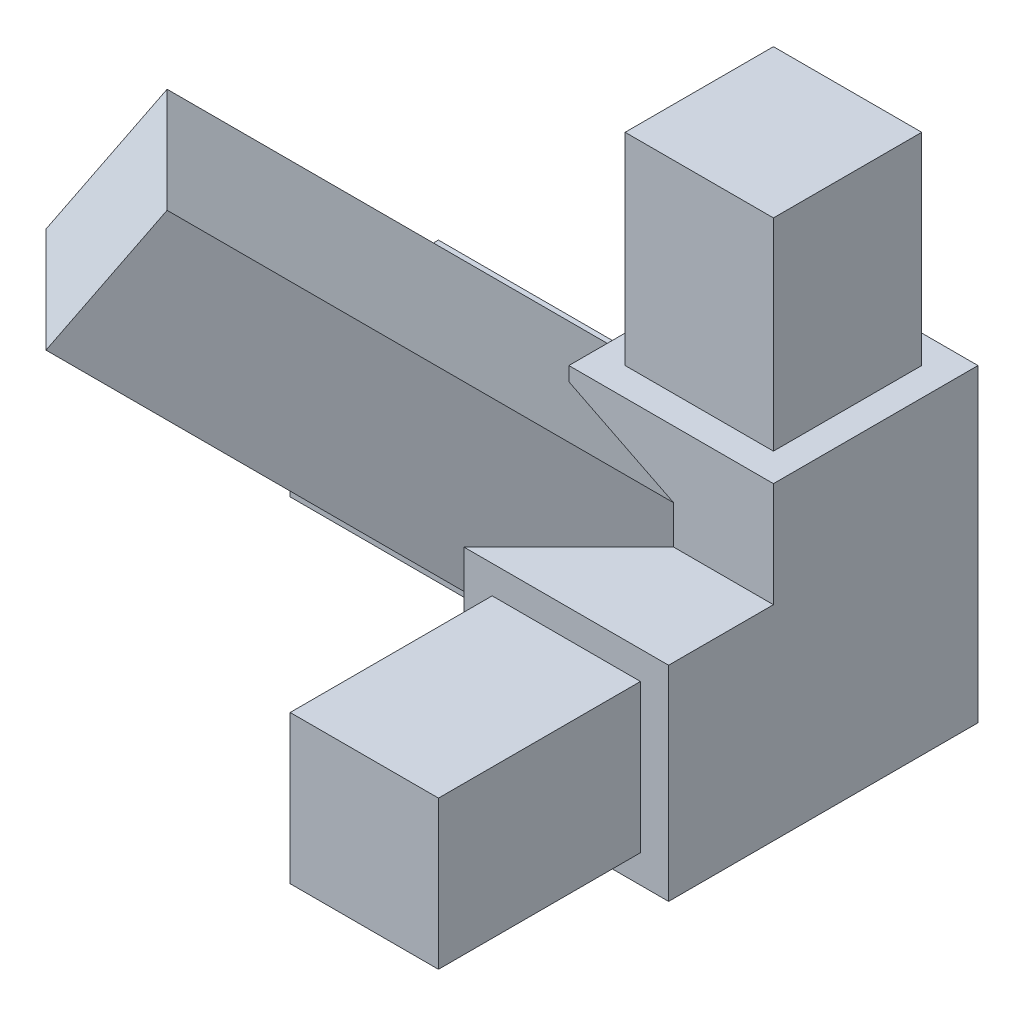
ISO-10303-21;
HEADER;
FILE_DESCRIPTION(('STEP AP214'),'2;1');
FILE_NAME('part.step','',(''),(''),'','','');
FILE_SCHEMA(('AUTOMOTIVE_DESIGN { 1 0 10303 214 1 1 1 1 }'));
ENDSEC;
DATA;
#1=APPLICATION_CONTEXT('core data for automotive mechanical design processes');
#2=APPLICATION_PROTOCOL_DEFINITION('international standard','automotive_design',2000,#1);
#3=PRODUCT_CONTEXT('',#1,'mechanical');
#4=PRODUCT('Part','Part','',(#3));
#5=PRODUCT_RELATED_PRODUCT_CATEGORY('part','',(#4));
#6=PRODUCT_DEFINITION_FORMATION('','',#4);
#7=PRODUCT_DEFINITION_CONTEXT('part definition',#1,'design');
#8=PRODUCT_DEFINITION('design','',#6,#7);
#9=PRODUCT_DEFINITION_SHAPE('','',#8);
#10=(LENGTH_UNIT() NAMED_UNIT(*) SI_UNIT(.MILLI.,.METRE.));
#11=(NAMED_UNIT(*) PLANE_ANGLE_UNIT() SI_UNIT($,.RADIAN.));
#12=(NAMED_UNIT(*) SI_UNIT($,.STERADIAN.) SOLID_ANGLE_UNIT());
#13=UNCERTAINTY_MEASURE_WITH_UNIT(LENGTH_MEASURE(1.E-05),#10,'distance_accuracy_value','');
#14=(GEOMETRIC_REPRESENTATION_CONTEXT(3) GLOBAL_UNCERTAINTY_ASSIGNED_CONTEXT((#13)) GLOBAL_UNIT_ASSIGNED_CONTEXT((#10,
#11,#12)) REPRESENTATION_CONTEXT('',''));
#15=CARTESIAN_POINT('',(0.,0.,0.));
#16=DIRECTION('',(0.,0.,1.));
#17=DIRECTION('',(1.,0.,0.));
#18=AXIS2_PLACEMENT_3D('',#15,#16,#17);
#19=CARTESIAN_POINT('',(-9.80563965077673,15.4080094432533,13.9068589816587));
#20=DIRECTION('',(0.707106781186547,0.,0.707106781186548));
#21=DIRECTION('',(0.707106781186548,0.,-0.707106781186547));
#22=AXIS2_PLACEMENT_3D('',#19,#20,#21);
#23=PLANE('',#22);
#24=DIRECTION('',(-0.707106781186548,0.,0.707106781186547));
#25=VECTOR('',#24,1.);
#26=CARTESIAN_POINT('',(7.23568440832457,4.,-3.13446507744259));
#27=LINE('',#26,#25);
#28=CARTESIAN_POINT('',(0.101219330881973,4.,4.));
#29=VERTEX_POINT('',#28);
#30=CARTESIAN_POINT('',(-3.99878066911803,4.,8.1));
#31=VERTEX_POINT('',#30);
#32=EDGE_CURVE('E334',#29,#31,#27,.T.);
#33=ORIENTED_EDGE('',*,*,#32,.F.);
#34=DIRECTION('',(0.,1.,0.));
#35=VECTOR('',#34,1.);
#36=CARTESIAN_POINT('',(0.101219330881976,15.4080094432533,4.));
#37=LINE('',#36,#35);
#38=CARTESIAN_POINT('',(0.101219330881973,5.50115046159462,4.));
#39=VERTEX_POINT('',#38);
#40=EDGE_CURVE('E261',#29,#39,#37,.T.);
#41=ORIENTED_EDGE('',*,*,#40,.T.);
#42=DIRECTION('',(0.577350269189626,-0.577350269189626,-0.577350269189626));
#43=VECTOR('',#42,1.);
#44=CARTESIAN_POINT('',(-9.80563965077673,15.4080094432533,13.9068589816587));
#45=LINE('',#44,#43);
#46=CARTESIAN_POINT('',(-9.80563965077673,15.4080094432533,13.9068589816587));
#47=VERTEX_POINT('',#46);
#48=EDGE_CURVE('E353',#47,#39,#45,.T.);
#49=ORIENTED_EDGE('',*,*,#48,.F.);
#50=DIRECTION('',(-0.408248290463863,-0.816496580927726,0.408248290463863));
#51=VECTOR('',#50,1.);
#52=CARTESIAN_POINT('',(-9.80563965077673,15.4080094432533,13.9068589816587));
#53=LINE('',#52,#51);
#54=CARTESIAN_POINT('',(-12.1734797354671,10.6723292738725,16.2746990663491));
#55=VERTEX_POINT('',#54);
#56=EDGE_CURVE('E336',#47,#55,#53,.T.);
#57=ORIENTED_EDGE('',*,*,#56,.T.);
#58=DIRECTION('',(0.577350269189626,-0.577350269189626,-0.577350269189626));
#59=VECTOR('',#58,1.);
#60=CARTESIAN_POINT('',(-12.1734797354671,10.6723292738725,16.2746990663491));
#61=LINE('',#60,#59);
#62=CARTESIAN_POINT('',(-3.99878066911803,2.49763020752341,8.1));
#63=VERTEX_POINT('',#62);
#64=EDGE_CURVE('E352',#55,#63,#61,.T.);
#65=ORIENTED_EDGE('',*,*,#64,.T.);
#66=DIRECTION('',(0.,1.,0.));
#67=VECTOR('',#66,1.);
#68=CARTESIAN_POINT('',(-3.99878066911802,15.4080094432533,8.1));
#69=LINE('',#68,#67);
#70=EDGE_CURVE('E433',#63,#31,#69,.T.);
#71=ORIENTED_EDGE('',*,*,#70,.T.);
#72=EDGE_LOOP('',(#33,#41,#49,#57,#65,#71));
#73=FACE_BOUND('',#72,.T.);
#74=ADVANCED_FACE('F39',(#73),#23,.T.);
#75=CARTESIAN_POINT('',(-13.9068589816587,15.4080094432533,9.80563965077673));
#76=DIRECTION('',(-0.707106781186548,0.,-0.707106781186548));
#77=DIRECTION('',(-0.707106781186548,0.,0.707106781186548));
#78=AXIS2_PLACEMENT_3D('',#75,#76,#77);
#79=PLANE('',#78);
#80=DIRECTION('',(0.577350269189626,-0.577350269189626,-0.577350269189626));
#81=VECTOR('',#80,1.);
#82=CARTESIAN_POINT('',(-13.9068589816587,15.4080094432533,9.80563965077673));
#83=LINE('',#82,#81);
#84=CARTESIAN_POINT('',(-13.9068589816587,15.4080094432533,9.80563965077673));
#85=VERTEX_POINT('',#84);
#86=CARTESIAN_POINT('',(-4.,5.50115046159462,-0.10121933088198));
#87=VERTEX_POINT('',#86);
#88=EDGE_CURVE('E357',#85,#87,#83,.T.);
#89=ORIENTED_EDGE('',*,*,#88,.T.);
#90=DIRECTION('',(0.,-1.,0.));
#91=VECTOR('',#90,1.);
#92=CARTESIAN_POINT('',(-4.,15.4080094432533,-0.101219330881976));
#93=LINE('',#92,#91);
#94=CARTESIAN_POINT('',(-4.,4.,-0.101219330881975));
#95=VERTEX_POINT('',#94);
#96=EDGE_CURVE('E264',#87,#95,#93,.T.);
#97=ORIENTED_EDGE('',*,*,#96,.T.);
#98=DIRECTION('',(0.707106781186548,0.,-0.707106781186548));
#99=VECTOR('',#98,1.);
#100=CARTESIAN_POINT('',(3.13446507744259,4.,-7.23568440832457));
#101=LINE('',#100,#99);
#102=CARTESIAN_POINT('',(-8.1,4.,3.99878066911802));
#103=VERTEX_POINT('',#102);
#104=EDGE_CURVE('E333',#103,#95,#101,.T.);
#105=ORIENTED_EDGE('',*,*,#104,.F.);
#106=DIRECTION('',(0.,1.,0.));
#107=VECTOR('',#106,1.);
#108=CARTESIAN_POINT('',(-8.1,15.4080094432533,3.99878066911802));
#109=LINE('',#108,#107);
#110=CARTESIAN_POINT('',(-8.1,2.4976302075234,3.99878066911802));
#111=VERTEX_POINT('',#110);
#112=EDGE_CURVE('E318',#111,#103,#109,.T.);
#113=ORIENTED_EDGE('',*,*,#112,.F.);
#114=DIRECTION('',(0.577350269189626,-0.577350269189626,-0.577350269189626));
#115=VECTOR('',#114,1.);
#116=CARTESIAN_POINT('',(-16.2746990663491,10.6723292738725,12.1734797354671));
#117=LINE('',#116,#115);
#118=CARTESIAN_POINT('',(-16.2746990663491,10.6723292738725,12.1734797354671));
#119=VERTEX_POINT('',#118);
#120=EDGE_CURVE('E360',#119,#111,#117,.T.);
#121=ORIENTED_EDGE('',*,*,#120,.F.);
#122=DIRECTION('',(0.408248290463863,0.816496580927726,-0.408248290463863));
#123=VECTOR('',#122,1.);
#124=CARTESIAN_POINT('',(-13.9068589816587,15.4080094432533,9.80563965077673));
#125=LINE('',#124,#123);
#126=EDGE_CURVE('E346',#119,#85,#125,.T.);
#127=ORIENTED_EDGE('',*,*,#126,.T.);
#128=EDGE_LOOP('',(#89,#97,#105,#113,#121,#127));
#129=FACE_BOUND('',#128,.T.);
#130=ADVANCED_FACE('F445',(#129),#79,.T.);
#131=CARTESIAN_POINT('',(0.,4.,0.));
#132=DIRECTION('',(0.,-1.,0.));
#133=DIRECTION('',(0.,0.,-1.));
#134=AXIS2_PLACEMENT_3D('',#131,#132,#133);
#135=PLANE('',#134);
#136=DIRECTION('',(0.,0.,1.));
#137=VECTOR('',#136,1.);
#138=CARTESIAN_POINT('',(-4.,4.,4.));
#139=LINE('',#138,#137);
#140=CARTESIAN_POINT('',(-4.,4.,-4.));
#141=VERTEX_POINT('',#140);
#142=EDGE_CURVE('E250',#141,#95,#139,.T.);
#143=ORIENTED_EDGE('',*,*,#142,.F.);
#144=DIRECTION('',(-1.,0.,0.));
#145=VECTOR('',#144,1.);
#146=CARTESIAN_POINT('',(-4.,4.,-4.));
#147=LINE('',#146,#145);
#148=CARTESIAN_POINT('',(-8.1,4.,-4.));
#149=VERTEX_POINT('',#148);
#150=EDGE_CURVE('E232',#141,#149,#147,.T.);
#151=ORIENTED_EDGE('',*,*,#150,.T.);
#152=DIRECTION('',(0.,0.,-1.));
#153=VECTOR('',#152,1.);
#154=CARTESIAN_POINT('',(-8.1,4.,4.));
#155=LINE('',#154,#153);
#156=EDGE_CURVE('E315',#103,#149,#155,.T.);
#157=ORIENTED_EDGE('',*,*,#156,.F.);
#158=ORIENTED_EDGE('',*,*,#104,.T.);
#159=EDGE_LOOP('',(#143,#151,#157,#158));
#160=FACE_BOUND('',#159,.T.);
#161=ADVANCED_FACE('F464',(#160),#135,.F.);
#162=DIRECTION('',(1.,0.,0.));
#163=VECTOR('',#162,1.);
#164=CARTESIAN_POINT('',(-4.,4.,4.));
#165=LINE('',#164,#163);
#166=CARTESIAN_POINT('',(4.,4.,4.));
#167=VERTEX_POINT('',#166);
#168=EDGE_CURVE('E248',#29,#167,#165,.T.);
#169=ORIENTED_EDGE('',*,*,#168,.F.);
#170=ORIENTED_EDGE('',*,*,#32,.T.);
#171=DIRECTION('',(-1.,0.,0.));
#172=VECTOR('',#171,1.);
#173=CARTESIAN_POINT('',(-4.,4.,8.1));
#174=LINE('',#173,#172);
#175=CARTESIAN_POINT('',(4.,4.,8.1));
#176=VERTEX_POINT('',#175);
#177=EDGE_CURVE('E276',#176,#31,#174,.T.);
#178=ORIENTED_EDGE('',*,*,#177,.F.);
#179=DIRECTION('',(0.,0.,-1.));
#180=VECTOR('',#179,1.);
#181=CARTESIAN_POINT('',(4.,4.,4.));
#182=LINE('',#181,#180);
#183=EDGE_CURVE('E422',#176,#167,#182,.T.);
#184=ORIENTED_EDGE('',*,*,#183,.T.);
#185=EDGE_LOOP('',(#169,#170,#178,#184));
#186=FACE_BOUND('',#185,.T.);
#187=ADVANCED_FACE('F459',(#186),#135,.F.);
#188=CARTESIAN_POINT('',(-13.9068589816587,15.4080094432533,9.80563965077673));
#189=DIRECTION('',(0.408248290463863,0.816496580927726,-0.408248290463863));
#190=DIRECTION('',(-0.894427190999916,0.447213595499958,0.));
#191=AXIS2_PLACEMENT_3D('',#188,#189,#190);
#192=PLANE('',#191);
#193=DIRECTION('',(-0.894427190999916,0.447213595499958,0.));
#194=VECTOR('',#193,1.);
#195=CARTESIAN_POINT('',(-15.0679869118141,13.0857535829426,4.));
#196=LINE('',#195,#194);
#197=CARTESIAN_POINT('',(-4.,7.55176012703561,4.));
#198=VERTEX_POINT('',#197);
#199=EDGE_CURVE('E436',#39,#198,#196,.T.);
#200=ORIENTED_EDGE('',*,*,#199,.T.);
#201=DIRECTION('',(0.,-0.447213595499958,-0.894427190999916));
#202=VECTOR('',#201,1.);
#203=CARTESIAN_POINT('',(-4.,11.4452658505898,11.7870114471085));
#204=LINE('',#203,#202);
#205=EDGE_CURVE('E47',#198,#87,#204,.T.);
#206=ORIENTED_EDGE('',*,*,#205,.T.);
#207=ORIENTED_EDGE('',*,*,#88,.F.);
#208=DIRECTION('',(0.707106781186547,0.,0.707106781186548));
#209=VECTOR('',#208,1.);
#210=CARTESIAN_POINT('',(-13.9068589816587,15.4080094432533,9.80563965077673));
#211=LINE('',#210,#209);
#212=EDGE_CURVE('E349',#85,#47,#211,.T.);
#213=ORIENTED_EDGE('',*,*,#212,.T.);
#214=ORIENTED_EDGE('',*,*,#48,.T.);
#215=EDGE_LOOP('',(#200,#206,#207,#213,#214));
#216=FACE_BOUND('',#215,.T.);
#217=ADVANCED_FACE('F441',(#216),#192,.T.);
#218=CARTESIAN_POINT('',(-16.2746990663491,10.6723292738725,12.1734797354671));
#219=DIRECTION('',(-0.408248290463863,-0.816496580927726,0.408248290463863));
#220=DIRECTION('',(0.,-0.447213595499958,-0.894427190999916));
#221=AXIS2_PLACEMENT_3D('',#218,#219,#220);
#222=PLANE('',#221);
#223=DIRECTION('',(-0.894427190999916,0.447213595499958,0.));
#224=VECTOR('',#223,1.);
#225=CARTESIAN_POINT('',(2.54019385747902,-2.82185705577512,4.));
#226=LINE('',#225,#224);
#227=CARTESIAN_POINT('',(-4.,0.448239872964393,4.));
#228=VERTEX_POINT('',#227);
#229=CARTESIAN_POINT('',(-8.1,2.49823987296439,4.));
#230=VERTEX_POINT('',#229);
#231=EDGE_CURVE('E337',#228,#230,#226,.T.);
#232=ORIENTED_EDGE('',*,*,#231,.F.);
#233=DIRECTION('',(0.,0.447213595499958,0.894427190999916));
#234=VECTOR('',#233,1.);
#235=CARTESIAN_POINT('',(-4.,5.76244964733288,14.628419548737));
#236=LINE('',#235,#234);
#237=CARTESIAN_POINT('',(-4.,2.49823987296439,8.1));
#238=VERTEX_POINT('',#237);
#239=EDGE_CURVE('E303',#228,#238,#236,.T.);
#240=ORIENTED_EDGE('',*,*,#239,.T.);
#241=DIRECTION('',(0.894427190999916,-0.447213595499958,0.));
#242=VECTOR('',#241,1.);
#243=CARTESIAN_POINT('',(-17.0893950134425,9.04293737968566,8.1));
#244=LINE('',#243,#242);
#245=EDGE_CURVE('E288',#238,#63,#244,.T.);
#246=ORIENTED_EDGE('',*,*,#245,.T.);
#247=ORIENTED_EDGE('',*,*,#64,.F.);
#248=DIRECTION('',(-0.707106781186548,0.,-0.707106781186548));
#249=VECTOR('',#248,1.);
#250=CARTESIAN_POINT('',(-16.2746990663491,10.6723292738725,12.1734797354671));
#251=LINE('',#250,#249);
#252=EDGE_CURVE('E343',#55,#119,#251,.T.);
#253=ORIENTED_EDGE('',*,*,#252,.T.);
#254=ORIENTED_EDGE('',*,*,#120,.T.);
#255=DIRECTION('',(0.,-0.447213595499958,-0.894427190999916));
#256=VECTOR('',#255,1.);
#257=CARTESIAN_POINT('',(-8.1,7.40244964733288,13.808419548737));
#258=LINE('',#257,#256);
#259=EDGE_CURVE('E231',#230,#111,#258,.T.);
#260=ORIENTED_EDGE('',*,*,#259,.F.);
#261=EDGE_LOOP('',(#232,#240,#246,#247,#253,#254,#260));
#262=FACE_BOUND('',#261,.T.);
#263=ADVANCED_FACE('F475',(#262),#222,.T.);
#264=CARTESIAN_POINT('',(-4.,4.,4.));
#265=DIRECTION('',(0.,0.,-1.));
#266=DIRECTION('',(-1.,0.,0.));
#267=AXIS2_PLACEMENT_3D('',#264,#265,#266);
#268=PLANE('',#267);
#269=DIRECTION('',(0.,-1.,0.));
#270=VECTOR('',#269,1.);
#271=CARTESIAN_POINT('',(-4.,-4.,4.));
#272=LINE('',#271,#270);
#273=CARTESIAN_POINT('',(-4.,-4.,4.));
#274=VERTEX_POINT('',#273);
#275=EDGE_CURVE('E272',#228,#274,#272,.T.);
#276=ORIENTED_EDGE('',*,*,#275,.F.);
#277=ORIENTED_EDGE('',*,*,#231,.T.);
#278=DIRECTION('',(0.,1.,0.));
#279=VECTOR('',#278,1.);
#280=CARTESIAN_POINT('',(-8.1,-4.,4.));
#281=LINE('',#280,#279);
#282=CARTESIAN_POINT('',(-8.1,-4.,4.));
#283=VERTEX_POINT('',#282);
#284=EDGE_CURVE('E312',#283,#230,#281,.T.);
#285=ORIENTED_EDGE('',*,*,#284,.F.);
#286=DIRECTION('',(1.,0.,0.));
#287=VECTOR('',#286,1.);
#288=CARTESIAN_POINT('',(-4.,-4.,4.));
#289=LINE('',#288,#287);
#290=EDGE_CURVE('E421',#283,#274,#289,.T.);
#291=ORIENTED_EDGE('',*,*,#290,.T.);
#292=EDGE_LOOP('',(#276,#277,#285,#291));
#293=FACE_BOUND('',#292,.T.);
#294=ADVANCED_FACE('F41',(#293),#268,.F.);
#295=CARTESIAN_POINT('',(4.,4.,4.));
#296=DIRECTION('',(-1.,0.,0.));
#297=DIRECTION('',(0.,0.,1.));
#298=AXIS2_PLACEMENT_3D('',#295,#296,#297);
#299=PLANE('',#298);
#300=DIRECTION('',(0.,0.,-1.));
#301=VECTOR('',#300,1.);
#302=CARTESIAN_POINT('',(4.,-4.,4.));
#303=LINE('',#302,#301);
#304=CARTESIAN_POINT('',(4.,-4.,8.1));
#305=VERTEX_POINT('',#304);
#306=CARTESIAN_POINT('',(4.,-4.,-4.));
#307=VERTEX_POINT('',#306);
#308=EDGE_CURVE('E228',#305,#307,#303,.T.);
#309=ORIENTED_EDGE('',*,*,#308,.T.);
#310=DIRECTION('',(0.,-1.,0.));
#311=VECTOR('',#310,1.);
#312=CARTESIAN_POINT('',(4.,4.,-4.));
#313=LINE('',#312,#311);
#314=CARTESIAN_POINT('',(4.,8.1,-4.));
#315=VERTEX_POINT('',#314);
#316=EDGE_CURVE('E221',#315,#307,#313,.T.);
#317=ORIENTED_EDGE('',*,*,#316,.F.);
#318=DIRECTION('',(0.,0.,-1.));
#319=VECTOR('',#318,1.);
#320=CARTESIAN_POINT('',(4.,8.1,4.));
#321=LINE('',#320,#319);
#322=CARTESIAN_POINT('',(4.,8.1,4.));
#323=VERTEX_POINT('',#322);
#324=EDGE_CURVE('E226',#323,#315,#321,.T.);
#325=ORIENTED_EDGE('',*,*,#324,.F.);
#326=DIRECTION('',(0.,-1.,0.));
#327=VECTOR('',#326,1.);
#328=CARTESIAN_POINT('',(4.,8.1,4.));
#329=LINE('',#328,#327);
#330=EDGE_CURVE('E255',#323,#167,#329,.T.);
#331=ORIENTED_EDGE('',*,*,#330,.T.);
#332=ORIENTED_EDGE('',*,*,#183,.F.);
#333=DIRECTION('',(0.,1.,0.));
#334=VECTOR('',#333,1.);
#335=CARTESIAN_POINT('',(4.,-4.,8.1));
#336=LINE('',#335,#334);
#337=EDGE_CURVE('E273',#305,#176,#336,.T.);
#338=ORIENTED_EDGE('',*,*,#337,.F.);
#339=EDGE_LOOP('',(#309,#317,#325,#331,#332,#338));
#340=FACE_BOUND('',#339,.T.);
#341=ADVANCED_FACE('F223',(#340),#299,.F.);
#342=CARTESIAN_POINT('',(-4.,4.,-4.));
#343=DIRECTION('',(0.,0.,1.));
#344=DIRECTION('',(1.,0.,0.));
#345=AXIS2_PLACEMENT_3D('',#342,#343,#344);
#346=PLANE('',#345);
#347=DIRECTION('',(-1.,0.,0.));
#348=VECTOR('',#347,1.);
#349=CARTESIAN_POINT('',(-4.,-4.,-4.));
#350=LINE('',#349,#348);
#351=CARTESIAN_POINT('',(-8.1,-4.,-4.));
#352=VERTEX_POINT('',#351);
#353=EDGE_CURVE('E425',#307,#352,#350,.T.);
#354=ORIENTED_EDGE('',*,*,#353,.T.);
#355=DIRECTION('',(0.,-1.,0.));
#356=VECTOR('',#355,1.);
#357=CARTESIAN_POINT('',(-8.1,-4.,-4.));
#358=LINE('',#357,#356);
#359=EDGE_CURVE('E306',#149,#352,#358,.T.);
#360=ORIENTED_EDGE('',*,*,#359,.F.);
#361=ORIENTED_EDGE('',*,*,#150,.F.);
#362=DIRECTION('',(0.,-1.,0.));
#363=VECTOR('',#362,1.);
#364=CARTESIAN_POINT('',(-4.,8.1,-4.));
#365=LINE('',#364,#363);
#366=CARTESIAN_POINT('',(-4.,8.1,-4.));
#367=VERTEX_POINT('',#366);
#368=EDGE_CURVE('E238',#367,#141,#365,.T.);
#369=ORIENTED_EDGE('',*,*,#368,.F.);
#370=DIRECTION('',(-1.,0.,0.));
#371=VECTOR('',#370,1.);
#372=CARTESIAN_POINT('',(-4.,8.1,-4.));
#373=LINE('',#372,#371);
#374=EDGE_CURVE('E235',#315,#367,#373,.T.);
#375=ORIENTED_EDGE('',*,*,#374,.F.);
#376=ORIENTED_EDGE('',*,*,#316,.T.);
#377=EDGE_LOOP('',(#354,#360,#361,#369,#375,#376));
#378=FACE_BOUND('',#377,.T.);
#379=ADVANCED_FACE('F236',(#378),#346,.F.);
#380=CARTESIAN_POINT('',(0.,-4.,0.));
#381=DIRECTION('',(0.,-1.,0.));
#382=DIRECTION('',(0.,0.,-1.));
#383=AXIS2_PLACEMENT_3D('',#380,#381,#382);
#384=PLANE('',#383);
#385=ORIENTED_EDGE('',*,*,#290,.F.);
#386=DIRECTION('',(0.,0.,1.));
#387=VECTOR('',#386,1.);
#388=CARTESIAN_POINT('',(-8.1,-4.,4.));
#389=LINE('',#388,#387);
#390=EDGE_CURVE('E309',#352,#283,#389,.T.);
#391=ORIENTED_EDGE('',*,*,#390,.F.);
#392=ORIENTED_EDGE('',*,*,#353,.F.);
#393=ORIENTED_EDGE('',*,*,#308,.F.);
#394=DIRECTION('',(1.,0.,0.));
#395=VECTOR('',#394,1.);
#396=CARTESIAN_POINT('',(-4.,-4.,8.1));
#397=LINE('',#396,#395);
#398=CARTESIAN_POINT('',(-4.,-4.,8.1));
#399=VERTEX_POINT('',#398);
#400=EDGE_CURVE('E281',#399,#305,#397,.T.);
#401=ORIENTED_EDGE('',*,*,#400,.F.);
#402=DIRECTION('',(0.,0.,-1.));
#403=VECTOR('',#402,1.);
#404=CARTESIAN_POINT('',(-4.,-4.,8.1));
#405=LINE('',#404,#403);
#406=EDGE_CURVE('E284',#399,#274,#405,.T.);
#407=ORIENTED_EDGE('',*,*,#406,.T.);
#408=EDGE_LOOP('',(#385,#391,#392,#393,#401,#407));
#409=FACE_BOUND('',#408,.T.);
#410=ADVANCED_FACE('F483',(#409),#384,.T.);
#411=CARTESIAN_POINT('',(-13.0401693585629,13.0401693585629,13.0401693585629));
#412=DIRECTION('',(-0.577350269189626,0.577350269189626,0.577350269189626));
#413=DIRECTION('',(0.,-0.707106781186548,0.707106781186548));
#414=AXIS2_PLACEMENT_3D('',#411,#412,#413);
#415=PLANE('',#414);
#416=ORIENTED_EDGE('',*,*,#56,.F.);
#417=ORIENTED_EDGE('',*,*,#212,.F.);
#418=ORIENTED_EDGE('',*,*,#126,.F.);
#419=ORIENTED_EDGE('',*,*,#252,.F.);
#420=EDGE_LOOP('',(#416,#417,#418,#419));
#421=FACE_BOUND('',#420,.T.);
#422=ADVANCED_FACE('F452',(#421),#415,.T.);
#423=CARTESIAN_POINT('',(-8.1,0.,0.));
#424=DIRECTION('',(-1.,0.,0.));
#425=DIRECTION('',(0.,0.,1.));
#426=AXIS2_PLACEMENT_3D('',#423,#424,#425);
#427=PLANE('',#426);
#428=ORIENTED_EDGE('',*,*,#259,.T.);
#429=ORIENTED_EDGE('',*,*,#112,.T.);
#430=ORIENTED_EDGE('',*,*,#156,.T.);
#431=ORIENTED_EDGE('',*,*,#359,.T.);
#432=ORIENTED_EDGE('',*,*,#390,.T.);
#433=ORIENTED_EDGE('',*,*,#284,.T.);
#434=EDGE_LOOP('',(#428,#429,#430,#431,#432,#433));
#435=FACE_BOUND('',#434,.T.);
#436=DIRECTION('',(0.,-1.,0.));
#437=VECTOR('',#436,1.);
#438=CARTESIAN_POINT('',(-8.1,-2.9,-2.9));
#439=LINE('',#438,#437);
#440=CARTESIAN_POINT('',(-8.1,2.9,-2.9));
#441=VERTEX_POINT('',#440);
#442=CARTESIAN_POINT('',(-8.1,-2.9,-2.9));
#443=VERTEX_POINT('',#442);
#444=EDGE_CURVE('E330',#441,#443,#439,.T.);
#445=ORIENTED_EDGE('',*,*,#444,.F.);
#446=DIRECTION('',(0.,0.,-1.));
#447=VECTOR('',#446,1.);
#448=CARTESIAN_POINT('',(-8.1,2.9,2.9));
#449=LINE('',#448,#447);
#450=CARTESIAN_POINT('',(-8.1,2.9,2.9));
#451=VERTEX_POINT('',#450);
#452=EDGE_CURVE('E321',#451,#441,#449,.T.);
#453=ORIENTED_EDGE('',*,*,#452,.F.);
#454=DIRECTION('',(0.,1.,0.));
#455=VECTOR('',#454,1.);
#456=CARTESIAN_POINT('',(-8.1,-2.9,2.9));
#457=LINE('',#456,#455);
#458=CARTESIAN_POINT('',(-8.1,-2.9,2.9));
#459=VERTEX_POINT('',#458);
#460=EDGE_CURVE('E324',#459,#451,#457,.T.);
#461=ORIENTED_EDGE('',*,*,#460,.F.);
#462=DIRECTION('',(0.,0.,1.));
#463=VECTOR('',#462,1.);
#464=CARTESIAN_POINT('',(-8.1,-2.9,2.9));
#465=LINE('',#464,#463);
#466=EDGE_CURVE('E327',#443,#459,#465,.T.);
#467=ORIENTED_EDGE('',*,*,#466,.F.);
#468=EDGE_LOOP('',(#445,#453,#461,#467));
#469=FACE_BOUND('',#468,.T.);
#470=ADVANCED_FACE('F469',(#435,#469),#427,.T.);
#471=CARTESIAN_POINT('',(-16.,0.,0.));
#472=DIRECTION('',(-1.,0.,0.));
#473=DIRECTION('',(0.,0.,1.));
#474=AXIS2_PLACEMENT_3D('',#471,#472,#473);
#475=PLANE('',#474);
#476=DIRECTION('',(0.,-1.,0.));
#477=VECTOR('',#476,1.);
#478=CARTESIAN_POINT('',(-16.,-2.9,-2.9));
#479=LINE('',#478,#477);
#480=CARTESIAN_POINT('',(-16.,2.9,-2.9));
#481=VERTEX_POINT('',#480);
#482=CARTESIAN_POINT('',(-16.,-2.9,-2.9));
#483=VERTEX_POINT('',#482);
#484=EDGE_CURVE('E356',#481,#483,#479,.T.);
#485=ORIENTED_EDGE('',*,*,#484,.T.);
#486=DIRECTION('',(0.,0.,1.));
#487=VECTOR('',#486,1.);
#488=CARTESIAN_POINT('',(-16.,-2.9,2.9));
#489=LINE('',#488,#487);
#490=CARTESIAN_POINT('',(-16.,-2.9,2.9));
#491=VERTEX_POINT('',#490);
#492=EDGE_CURVE('E366',#483,#491,#489,.T.);
#493=ORIENTED_EDGE('',*,*,#492,.T.);
#494=DIRECTION('',(0.,1.,0.));
#495=VECTOR('',#494,1.);
#496=CARTESIAN_POINT('',(-16.,-2.9,2.9));
#497=LINE('',#496,#495);
#498=CARTESIAN_POINT('',(-16.,2.9,2.9));
#499=VERTEX_POINT('',#498);
#500=EDGE_CURVE('E368',#491,#499,#497,.T.);
#501=ORIENTED_EDGE('',*,*,#500,.T.);
#502=DIRECTION('',(0.,0.,-1.));
#503=VECTOR('',#502,1.);
#504=CARTESIAN_POINT('',(-16.,2.9,2.9));
#505=LINE('',#504,#503);
#506=EDGE_CURVE('E370',#499,#481,#505,.T.);
#507=ORIENTED_EDGE('',*,*,#506,.T.);
#508=EDGE_LOOP('',(#485,#493,#501,#507));
#509=FACE_BOUND('',#508,.T.);
#510=ADVANCED_FACE('F511',(#509),#475,.T.);
#511=CARTESIAN_POINT('',(-16.,2.9,2.9));
#512=DIRECTION('',(0.,-1.,0.));
#513=DIRECTION('',(0.,0.,-1.));
#514=AXIS2_PLACEMENT_3D('',#511,#512,#513);
#515=PLANE('',#514);
#516=DIRECTION('',(1.,0.,0.));
#517=VECTOR('',#516,1.);
#518=CARTESIAN_POINT('',(-16.,2.9,2.9));
#519=LINE('',#518,#517);
#520=EDGE_CURVE('E375',#499,#451,#519,.T.);
#521=ORIENTED_EDGE('',*,*,#520,.T.);
#522=ORIENTED_EDGE('',*,*,#452,.T.);
#523=DIRECTION('',(1.,0.,0.));
#524=VECTOR('',#523,1.);
#525=CARTESIAN_POINT('',(-16.,2.9,-2.9));
#526=LINE('',#525,#524);
#527=EDGE_CURVE('E372',#481,#441,#526,.T.);
#528=ORIENTED_EDGE('',*,*,#527,.F.);
#529=ORIENTED_EDGE('',*,*,#506,.F.);
#530=EDGE_LOOP('',(#521,#522,#528,#529));
#531=FACE_BOUND('',#530,.T.);
#532=ADVANCED_FACE('F514',(#531),#515,.F.);
#533=CARTESIAN_POINT('',(-16.,-2.9,2.9));
#534=DIRECTION('',(0.,0.,-1.));
#535=DIRECTION('',(-1.,0.,0.));
#536=AXIS2_PLACEMENT_3D('',#533,#534,#535);
#537=PLANE('',#536);
#538=DIRECTION('',(1.,0.,0.));
#539=VECTOR('',#538,1.);
#540=CARTESIAN_POINT('',(-16.,-2.9,2.9));
#541=LINE('',#540,#539);
#542=EDGE_CURVE('E378',#491,#459,#541,.T.);
#543=ORIENTED_EDGE('',*,*,#542,.T.);
#544=ORIENTED_EDGE('',*,*,#460,.T.);
#545=ORIENTED_EDGE('',*,*,#520,.F.);
#546=ORIENTED_EDGE('',*,*,#500,.F.);
#547=EDGE_LOOP('',(#543,#544,#545,#546));
#548=FACE_BOUND('',#547,.T.);
#549=ADVANCED_FACE('F518',(#548),#537,.F.);
#550=CARTESIAN_POINT('',(-16.,-2.9,2.9));
#551=DIRECTION('',(0.,1.,0.));
#552=DIRECTION('',(0.,0.,1.));
#553=AXIS2_PLACEMENT_3D('',#550,#551,#552);
#554=PLANE('',#553);
#555=DIRECTION('',(1.,0.,0.));
#556=VECTOR('',#555,1.);
#557=CARTESIAN_POINT('',(-16.,-2.9,-2.9));
#558=LINE('',#557,#556);
#559=EDGE_CURVE('E381',#483,#443,#558,.T.);
#560=ORIENTED_EDGE('',*,*,#559,.T.);
#561=ORIENTED_EDGE('',*,*,#466,.T.);
#562=ORIENTED_EDGE('',*,*,#542,.F.);
#563=ORIENTED_EDGE('',*,*,#492,.F.);
#564=EDGE_LOOP('',(#560,#561,#562,#563));
#565=FACE_BOUND('',#564,.T.);
#566=ADVANCED_FACE('F522',(#565),#554,.F.);
#567=CARTESIAN_POINT('',(-16.,-2.9,-2.9));
#568=DIRECTION('',(0.,0.,1.));
#569=DIRECTION('',(1.,0.,0.));
#570=AXIS2_PLACEMENT_3D('',#567,#568,#569);
#571=PLANE('',#570);
#572=ORIENTED_EDGE('',*,*,#527,.T.);
#573=ORIENTED_EDGE('',*,*,#444,.T.);
#574=ORIENTED_EDGE('',*,*,#559,.F.);
#575=ORIENTED_EDGE('',*,*,#484,.F.);
#576=EDGE_LOOP('',(#572,#573,#574,#575));
#577=FACE_BOUND('',#576,.T.);
#578=ADVANCED_FACE('F499',(#577),#571,.F.);
#579=CARTESIAN_POINT('',(0.,0.,8.1));
#580=DIRECTION('',(0.,0.,-1.));
#581=DIRECTION('',(-1.,0.,0.));
#582=AXIS2_PLACEMENT_3D('',#579,#580,#581);
#583=PLANE('',#582);
#584=ORIENTED_EDGE('',*,*,#245,.F.);
#585=DIRECTION('',(0.,-1.,0.));
#586=VECTOR('',#585,1.);
#587=CARTESIAN_POINT('',(-4.,-4.,8.1));
#588=LINE('',#587,#586);
#589=EDGE_CURVE('E279',#238,#399,#588,.T.);
#590=ORIENTED_EDGE('',*,*,#589,.T.);
#591=ORIENTED_EDGE('',*,*,#400,.T.);
#592=ORIENTED_EDGE('',*,*,#337,.T.);
#593=ORIENTED_EDGE('',*,*,#177,.T.);
#594=ORIENTED_EDGE('',*,*,#70,.F.);
#595=EDGE_LOOP('',(#584,#590,#591,#592,#593,#594));
#596=FACE_BOUND('',#595,.T.);
#597=DIRECTION('',(1.,0.,0.));
#598=VECTOR('',#597,1.);
#599=CARTESIAN_POINT('',(-2.9,2.9,8.1));
#600=LINE('',#599,#598);
#601=CARTESIAN_POINT('',(-2.9,2.9,8.1));
#602=VERTEX_POINT('',#601);
#603=CARTESIAN_POINT('',(2.9,2.9,8.1));
#604=VERTEX_POINT('',#603);
#605=EDGE_CURVE('E297',#602,#604,#600,.T.);
#606=ORIENTED_EDGE('',*,*,#605,.T.);
#607=DIRECTION('',(0.,-1.,0.));
#608=VECTOR('',#607,1.);
#609=CARTESIAN_POINT('',(2.9,2.9,8.1));
#610=LINE('',#609,#608);
#611=CARTESIAN_POINT('',(2.9,-2.9,8.1));
#612=VERTEX_POINT('',#611);
#613=EDGE_CURVE('E300',#604,#612,#610,.T.);
#614=ORIENTED_EDGE('',*,*,#613,.T.);
#615=DIRECTION('',(-1.,0.,0.));
#616=VECTOR('',#615,1.);
#617=CARTESIAN_POINT('',(-2.9,-2.9,8.1));
#618=LINE('',#617,#616);
#619=CARTESIAN_POINT('',(-2.9,-2.9,8.1));
#620=VERTEX_POINT('',#619);
#621=EDGE_CURVE('E291',#612,#620,#618,.T.);
#622=ORIENTED_EDGE('',*,*,#621,.T.);
#623=DIRECTION('',(0.,1.,0.));
#624=VECTOR('',#623,1.);
#625=CARTESIAN_POINT('',(-2.9,2.9,8.1));
#626=LINE('',#625,#624);
#627=EDGE_CURVE('E294',#620,#602,#626,.T.);
#628=ORIENTED_EDGE('',*,*,#627,.T.);
#629=EDGE_LOOP('',(#606,#614,#622,#628));
#630=FACE_BOUND('',#629,.T.);
#631=ADVANCED_FACE('F477',(#596,#630),#583,.F.);
#632=CARTESIAN_POINT('',(-4.,-4.,8.1));
#633=DIRECTION('',(1.,0.,0.));
#634=DIRECTION('',(0.,0.,-1.));
#635=AXIS2_PLACEMENT_3D('',#632,#633,#634);
#636=PLANE('',#635);
#637=ORIENTED_EDGE('',*,*,#239,.F.);
#638=ORIENTED_EDGE('',*,*,#275,.T.);
#639=ORIENTED_EDGE('',*,*,#406,.F.);
#640=ORIENTED_EDGE('',*,*,#589,.F.);
#641=EDGE_LOOP('',(#637,#638,#639,#640));
#642=FACE_BOUND('',#641,.T.);
#643=ADVANCED_FACE('F487',(#642),#636,.F.);
#644=CARTESIAN_POINT('',(0.,0.,16.));
#645=DIRECTION('',(0.,0.,1.));
#646=DIRECTION('',(1.,0.,0.));
#647=AXIS2_PLACEMENT_3D('',#644,#645,#646);
#648=PLANE('',#647);
#649=DIRECTION('',(0.,1.,0.));
#650=VECTOR('',#649,1.);
#651=CARTESIAN_POINT('',(2.9,2.9,16.));
#652=LINE('',#651,#650);
#653=CARTESIAN_POINT('',(2.9,-2.9,16.));
#654=VERTEX_POINT('',#653);
#655=CARTESIAN_POINT('',(2.9,2.9,16.));
#656=VERTEX_POINT('',#655);
#657=EDGE_CURVE('E401',#654,#656,#652,.T.);
#658=ORIENTED_EDGE('',*,*,#657,.T.);
#659=DIRECTION('',(-1.,0.,0.));
#660=VECTOR('',#659,1.);
#661=CARTESIAN_POINT('',(-2.9,2.9,16.));
#662=LINE('',#661,#660);
#663=CARTESIAN_POINT('',(-2.9,2.9,16.));
#664=VERTEX_POINT('',#663);
#665=EDGE_CURVE('E404',#656,#664,#662,.T.);
#666=ORIENTED_EDGE('',*,*,#665,.T.);
#667=DIRECTION('',(0.,-1.,0.));
#668=VECTOR('',#667,1.);
#669=CARTESIAN_POINT('',(-2.9,2.9,16.));
#670=LINE('',#669,#668);
#671=CARTESIAN_POINT('',(-2.9,-2.9,16.));
#672=VERTEX_POINT('',#671);
#673=EDGE_CURVE('E406',#664,#672,#670,.T.);
#674=ORIENTED_EDGE('',*,*,#673,.T.);
#675=DIRECTION('',(1.,0.,0.));
#676=VECTOR('',#675,1.);
#677=CARTESIAN_POINT('',(-2.9,-2.9,16.));
#678=LINE('',#677,#676);
#679=EDGE_CURVE('E408',#672,#654,#678,.T.);
#680=ORIENTED_EDGE('',*,*,#679,.T.);
#681=EDGE_LOOP('',(#658,#666,#674,#680));
#682=FACE_BOUND('',#681,.T.);
#683=ADVANCED_FACE('F489',(#682),#648,.T.);
#684=CARTESIAN_POINT('',(-2.9,-2.9,16.));
#685=DIRECTION('',(0.,1.,0.));
#686=DIRECTION('',(0.,0.,1.));
#687=AXIS2_PLACEMENT_3D('',#684,#685,#686);
#688=PLANE('',#687);
#689=ORIENTED_EDGE('',*,*,#621,.F.);
#690=DIRECTION('',(0.,0.,-1.));
#691=VECTOR('',#690,1.);
#692=CARTESIAN_POINT('',(2.9,-2.9,16.));
#693=LINE('',#692,#691);
#694=EDGE_CURVE('E410',#654,#612,#693,.T.);
#695=ORIENTED_EDGE('',*,*,#694,.F.);
#696=ORIENTED_EDGE('',*,*,#679,.F.);
#697=DIRECTION('',(0.,0.,-1.));
#698=VECTOR('',#697,1.);
#699=CARTESIAN_POINT('',(-2.9,-2.9,16.));
#700=LINE('',#699,#698);
#701=EDGE_CURVE('E413',#672,#620,#700,.T.);
#702=ORIENTED_EDGE('',*,*,#701,.T.);
#703=EDGE_LOOP('',(#689,#695,#696,#702));
#704=FACE_BOUND('',#703,.T.);
#705=ADVANCED_FACE('F496',(#704),#688,.F.);
#706=CARTESIAN_POINT('',(-2.9,2.9,16.));
#707=DIRECTION('',(1.,0.,0.));
#708=DIRECTION('',(0.,1.,0.));
#709=AXIS2_PLACEMENT_3D('',#706,#707,#708);
#710=PLANE('',#709);
#711=ORIENTED_EDGE('',*,*,#627,.F.);
#712=ORIENTED_EDGE('',*,*,#701,.F.);
#713=ORIENTED_EDGE('',*,*,#673,.F.);
#714=DIRECTION('',(0.,0.,-1.));
#715=VECTOR('',#714,1.);
#716=CARTESIAN_POINT('',(-2.9,2.9,16.));
#717=LINE('',#716,#715);
#718=EDGE_CURVE('E415',#664,#602,#717,.T.);
#719=ORIENTED_EDGE('',*,*,#718,.T.);
#720=EDGE_LOOP('',(#711,#712,#713,#719));
#721=FACE_BOUND('',#720,.T.);
#722=ADVANCED_FACE('F549',(#721),#710,.F.);
#723=CARTESIAN_POINT('',(-2.9,2.9,16.));
#724=DIRECTION('',(0.,-1.,0.));
#725=DIRECTION('',(0.,0.,-1.));
#726=AXIS2_PLACEMENT_3D('',#723,#724,#725);
#727=PLANE('',#726);
#728=ORIENTED_EDGE('',*,*,#605,.F.);
#729=ORIENTED_EDGE('',*,*,#718,.F.);
#730=ORIENTED_EDGE('',*,*,#665,.F.);
#731=DIRECTION('',(0.,0.,-1.));
#732=VECTOR('',#731,1.);
#733=CARTESIAN_POINT('',(2.9,2.9,16.));
#734=LINE('',#733,#732);
#735=EDGE_CURVE('E418',#656,#604,#734,.T.);
#736=ORIENTED_EDGE('',*,*,#735,.T.);
#737=EDGE_LOOP('',(#728,#729,#730,#736));
#738=FACE_BOUND('',#737,.T.);
#739=ADVANCED_FACE('F553',(#738),#727,.F.);
#740=CARTESIAN_POINT('',(2.9,2.9,16.));
#741=DIRECTION('',(-1.,0.,0.));
#742=DIRECTION('',(0.,0.,1.));
#743=AXIS2_PLACEMENT_3D('',#740,#741,#742);
#744=PLANE('',#743);
#745=ORIENTED_EDGE('',*,*,#613,.F.);
#746=ORIENTED_EDGE('',*,*,#735,.F.);
#747=ORIENTED_EDGE('',*,*,#657,.F.);
#748=ORIENTED_EDGE('',*,*,#694,.T.);
#749=EDGE_LOOP('',(#745,#746,#747,#748));
#750=FACE_BOUND('',#749,.T.);
#751=ADVANCED_FACE('F557',(#750),#744,.F.);
#752=CARTESIAN_POINT('',(0.,8.1,0.));
#753=DIRECTION('',(0.,-1.,0.));
#754=DIRECTION('',(0.,0.,-1.));
#755=AXIS2_PLACEMENT_3D('',#752,#753,#754);
#756=PLANE('',#755);
#757=ORIENTED_EDGE('',*,*,#324,.T.);
#758=ORIENTED_EDGE('',*,*,#374,.T.);
#759=DIRECTION('',(0.,0.,1.));
#760=VECTOR('',#759,1.);
#761=CARTESIAN_POINT('',(-4.,8.1,4.));
#762=LINE('',#761,#760);
#763=CARTESIAN_POINT('',(-4.,8.1,4.));
#764=VERTEX_POINT('',#763);
#765=EDGE_CURVE('E241',#367,#764,#762,.T.);
#766=ORIENTED_EDGE('',*,*,#765,.T.);
#767=DIRECTION('',(1.,0.,0.));
#768=VECTOR('',#767,1.);
#769=CARTESIAN_POINT('',(-4.,8.1,4.));
#770=LINE('',#769,#768);
#771=EDGE_CURVE('E246',#764,#323,#770,.T.);
#772=ORIENTED_EDGE('',*,*,#771,.T.);
#773=EDGE_LOOP('',(#757,#758,#766,#772));
#774=FACE_BOUND('',#773,.T.);
#775=DIRECTION('',(1.,0.,0.));
#776=VECTOR('',#775,1.);
#777=CARTESIAN_POINT('',(-2.9,8.1,-2.9));
#778=LINE('',#777,#776);
#779=CARTESIAN_POINT('',(-2.9,8.1,-2.9));
#780=VERTEX_POINT('',#779);
#781=CARTESIAN_POINT('',(2.9,8.1,-2.9));
#782=VERTEX_POINT('',#781);
#783=EDGE_CURVE('E61',#780,#782,#778,.T.);
#784=ORIENTED_EDGE('',*,*,#783,.T.);
#785=DIRECTION('',(0.,0.,1.));
#786=VECTOR('',#785,1.);
#787=CARTESIAN_POINT('',(2.9,8.1,-2.9));
#788=LINE('',#787,#786);
#789=CARTESIAN_POINT('',(2.9,8.1,2.9));
#790=VERTEX_POINT('',#789);
#791=EDGE_CURVE('E54',#782,#790,#788,.T.);
#792=ORIENTED_EDGE('',*,*,#791,.T.);
#793=DIRECTION('',(-1.,0.,0.));
#794=VECTOR('',#793,1.);
#795=CARTESIAN_POINT('',(-2.9,8.1,2.9));
#796=LINE('',#795,#794);
#797=CARTESIAN_POINT('',(-2.9,8.1,2.9));
#798=VERTEX_POINT('',#797);
#799=EDGE_CURVE('E11',#790,#798,#796,.T.);
#800=ORIENTED_EDGE('',*,*,#799,.T.);
#801=DIRECTION('',(0.,0.,-1.));
#802=VECTOR('',#801,1.);
#803=CARTESIAN_POINT('',(-2.9,8.1,-2.9));
#804=LINE('',#803,#802);
#805=EDGE_CURVE('E267',#798,#780,#804,.T.);
#806=ORIENTED_EDGE('',*,*,#805,.T.);
#807=EDGE_LOOP('',(#784,#792,#800,#806));
#808=FACE_BOUND('',#807,.T.);
#809=ADVANCED_FACE('F243',(#774,#808),#756,.F.);
#810=CARTESIAN_POINT('',(-4.,8.1,4.));
#811=DIRECTION('',(1.,0.,0.));
#812=DIRECTION('',(0.,0.,-1.));
#813=AXIS2_PLACEMENT_3D('',#810,#811,#812);
#814=PLANE('',#813);
#815=ORIENTED_EDGE('',*,*,#96,.F.);
#816=ORIENTED_EDGE('',*,*,#205,.F.);
#817=DIRECTION('',(0.,-1.,0.));
#818=VECTOR('',#817,1.);
#819=CARTESIAN_POINT('',(-4.,8.1,4.));
#820=LINE('',#819,#818);
#821=EDGE_CURVE('E258',#764,#198,#820,.T.);
#822=ORIENTED_EDGE('',*,*,#821,.F.);
#823=ORIENTED_EDGE('',*,*,#765,.F.);
#824=ORIENTED_EDGE('',*,*,#368,.T.);
#825=ORIENTED_EDGE('',*,*,#142,.T.);
#826=EDGE_LOOP('',(#815,#816,#822,#823,#824,#825));
#827=FACE_BOUND('',#826,.T.);
#828=ADVANCED_FACE('F461',(#827),#814,.F.);
#829=CARTESIAN_POINT('',(-4.,8.1,4.));
#830=DIRECTION('',(0.,0.,-1.));
#831=DIRECTION('',(-1.,0.,0.));
#832=AXIS2_PLACEMENT_3D('',#829,#830,#831);
#833=PLANE('',#832);
#834=ORIENTED_EDGE('',*,*,#40,.F.);
#835=ORIENTED_EDGE('',*,*,#168,.T.);
#836=ORIENTED_EDGE('',*,*,#330,.F.);
#837=ORIENTED_EDGE('',*,*,#771,.F.);
#838=ORIENTED_EDGE('',*,*,#821,.T.);
#839=ORIENTED_EDGE('',*,*,#199,.F.);
#840=EDGE_LOOP('',(#834,#835,#836,#837,#838,#839));
#841=FACE_BOUND('',#840,.T.);
#842=ADVANCED_FACE('F457',(#841),#833,.F.);
#843=CARTESIAN_POINT('',(0.,16.,0.));
#844=DIRECTION('',(0.,1.,0.));
#845=DIRECTION('',(0.,0.,1.));
#846=AXIS2_PLACEMENT_3D('',#843,#844,#845);
#847=PLANE('',#846);
#848=DIRECTION('',(0.,0.,-1.));
#849=VECTOR('',#848,1.);
#850=CARTESIAN_POINT('',(2.9,16.,-2.9));
#851=LINE('',#850,#849);
#852=CARTESIAN_POINT('',(2.9,16.,2.9));
#853=VERTEX_POINT('',#852);
#854=CARTESIAN_POINT('',(2.9,16.,-2.9));
#855=VERTEX_POINT('',#854);
#856=EDGE_CURVE('E384',#853,#855,#851,.T.);
#857=ORIENTED_EDGE('',*,*,#856,.T.);
#858=DIRECTION('',(-1.,0.,0.));
#859=VECTOR('',#858,1.);
#860=CARTESIAN_POINT('',(-2.9,16.,-2.9));
#861=LINE('',#860,#859);
#862=CARTESIAN_POINT('',(-2.9,16.,-2.9));
#863=VERTEX_POINT('',#862);
#864=EDGE_CURVE('E387',#855,#863,#861,.T.);
#865=ORIENTED_EDGE('',*,*,#864,.T.);
#866=DIRECTION('',(0.,0.,1.));
#867=VECTOR('',#866,1.);
#868=CARTESIAN_POINT('',(-2.9,16.,-2.9));
#869=LINE('',#868,#867);
#870=CARTESIAN_POINT('',(-2.9,16.,2.9));
#871=VERTEX_POINT('',#870);
#872=EDGE_CURVE('E389',#863,#871,#869,.T.);
#873=ORIENTED_EDGE('',*,*,#872,.T.);
#874=DIRECTION('',(1.,0.,0.));
#875=VECTOR('',#874,1.);
#876=CARTESIAN_POINT('',(-2.9,16.,2.9));
#877=LINE('',#876,#875);
#878=EDGE_CURVE('E391',#871,#853,#877,.T.);
#879=ORIENTED_EDGE('',*,*,#878,.T.);
#880=EDGE_LOOP('',(#857,#865,#873,#879));
#881=FACE_BOUND('',#880,.T.);
#882=ADVANCED_FACE('F530',(#881),#847,.T.);
#883=CARTESIAN_POINT('',(-2.9,16.,2.9));
#884=DIRECTION('',(0.,0.,-1.));
#885=DIRECTION('',(-1.,0.,0.));
#886=AXIS2_PLACEMENT_3D('',#883,#884,#885);
#887=PLANE('',#886);
#888=ORIENTED_EDGE('',*,*,#799,.F.);
#889=DIRECTION('',(0.,-1.,0.));
#890=VECTOR('',#889,1.);
#891=CARTESIAN_POINT('',(2.9,16.,2.9));
#892=LINE('',#891,#890);
#893=EDGE_CURVE('E393',#853,#790,#892,.T.);
#894=ORIENTED_EDGE('',*,*,#893,.F.);
#895=ORIENTED_EDGE('',*,*,#878,.F.);
#896=DIRECTION('',(0.,-1.,0.));
#897=VECTOR('',#896,1.);
#898=CARTESIAN_POINT('',(-2.9,16.,2.9));
#899=LINE('',#898,#897);
#900=EDGE_CURVE('E395',#871,#798,#899,.T.);
#901=ORIENTED_EDGE('',*,*,#900,.T.);
#902=EDGE_LOOP('',(#888,#894,#895,#901));
#903=FACE_BOUND('',#902,.T.);
#904=ADVANCED_FACE('F533',(#903),#887,.F.);
#905=CARTESIAN_POINT('',(-2.9,16.,-2.9));
#906=DIRECTION('',(1.,0.,0.));
#907=DIRECTION('',(0.,0.,-1.));
#908=AXIS2_PLACEMENT_3D('',#905,#906,#907);
#909=PLANE('',#908);
#910=ORIENTED_EDGE('',*,*,#805,.F.);
#911=ORIENTED_EDGE('',*,*,#900,.F.);
#912=ORIENTED_EDGE('',*,*,#872,.F.);
#913=DIRECTION('',(0.,-1.,0.));
#914=VECTOR('',#913,1.);
#915=CARTESIAN_POINT('',(-2.9,16.,-2.9));
#916=LINE('',#915,#914);
#917=EDGE_CURVE('E397',#863,#780,#916,.T.);
#918=ORIENTED_EDGE('',*,*,#917,.T.);
#919=EDGE_LOOP('',(#910,#911,#912,#918));
#920=FACE_BOUND('',#919,.T.);
#921=ADVANCED_FACE('F537',(#920),#909,.F.);
#922=CARTESIAN_POINT('',(-2.9,16.,-2.9));
#923=DIRECTION('',(0.,0.,1.));
#924=DIRECTION('',(1.,0.,0.));
#925=AXIS2_PLACEMENT_3D('',#922,#923,#924);
#926=PLANE('',#925);
#927=ORIENTED_EDGE('',*,*,#783,.F.);
#928=ORIENTED_EDGE('',*,*,#917,.F.);
#929=ORIENTED_EDGE('',*,*,#864,.F.);
#930=DIRECTION('',(0.,-1.,0.));
#931=VECTOR('',#930,1.);
#932=CARTESIAN_POINT('',(2.9,16.,-2.9));
#933=LINE('',#932,#931);
#934=EDGE_CURVE('E399',#855,#782,#933,.T.);
#935=ORIENTED_EDGE('',*,*,#934,.T.);
#936=EDGE_LOOP('',(#927,#928,#929,#935));
#937=FACE_BOUND('',#936,.T.);
#938=ADVANCED_FACE('F541',(#937),#926,.F.);
#939=CARTESIAN_POINT('',(2.9,16.,-2.9));
#940=DIRECTION('',(-1.,0.,0.));
#941=DIRECTION('',(0.,0.,1.));
#942=AXIS2_PLACEMENT_3D('',#939,#940,#941);
#943=PLANE('',#942);
#944=ORIENTED_EDGE('',*,*,#791,.F.);
#945=ORIENTED_EDGE('',*,*,#934,.F.);
#946=ORIENTED_EDGE('',*,*,#856,.F.);
#947=ORIENTED_EDGE('',*,*,#893,.T.);
#948=EDGE_LOOP('',(#944,#945,#946,#947));
#949=FACE_BOUND('',#948,.T.);
#950=ADVANCED_FACE('F545',(#949),#943,.F.);
#951=CLOSED_SHELL('',(#74,#130,#161,#187,#217,#263,#294,#341,#379,#410,#422,#470,#510,#532,#549,
#566,#578,#631,#643,#683,#705,#722,#739,#751,#809,#828,#842,#882,#904,#921,#938,#950));
#952=MANIFOLD_SOLID_BREP('B2',#951);
#953=ADVANCED_BREP_SHAPE_REPRESENTATION('',(#18,#952),#14);
#954=SHAPE_DEFINITION_REPRESENTATION(#9,#953);
ENDSEC;
END-ISO-10303-21;
